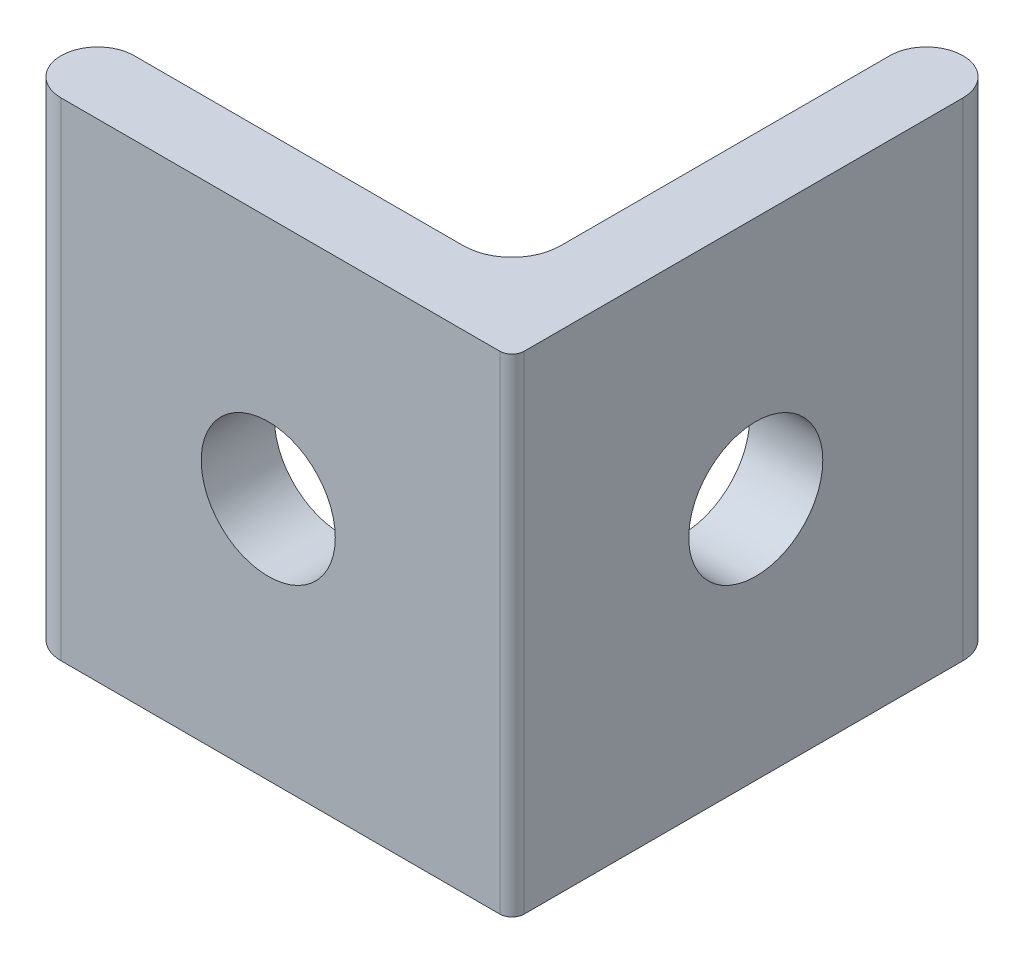
ISO-10303-21;
HEADER;
FILE_DESCRIPTION(('STEP AP214'),'2;1');
FILE_NAME('part.step','',(''),(''),'','','');
FILE_SCHEMA(('AUTOMOTIVE_DESIGN { 1 0 10303 214 1 1 1 1 }'));
ENDSEC;
DATA;
#1=APPLICATION_CONTEXT('core data for automotive mechanical design processes');
#2=APPLICATION_PROTOCOL_DEFINITION('international standard','automotive_design',2000,#1);
#3=PRODUCT_CONTEXT('',#1,'mechanical');
#4=PRODUCT('Part','Part','',(#3));
#5=PRODUCT_RELATED_PRODUCT_CATEGORY('part','',(#4));
#6=PRODUCT_DEFINITION_FORMATION('','',#4);
#7=PRODUCT_DEFINITION_CONTEXT('part definition',#1,'design');
#8=PRODUCT_DEFINITION('design','',#6,#7);
#9=PRODUCT_DEFINITION_SHAPE('','',#8);
#10=(LENGTH_UNIT() NAMED_UNIT(*) SI_UNIT(.MILLI.,.METRE.));
#11=(NAMED_UNIT(*) PLANE_ANGLE_UNIT() SI_UNIT($,.RADIAN.));
#12=(NAMED_UNIT(*) SI_UNIT($,.STERADIAN.) SOLID_ANGLE_UNIT());
#13=UNCERTAINTY_MEASURE_WITH_UNIT(LENGTH_MEASURE(1.E-05),#10,'distance_accuracy_value','');
#14=(GEOMETRIC_REPRESENTATION_CONTEXT(3) GLOBAL_UNCERTAINTY_ASSIGNED_CONTEXT((#13)) GLOBAL_UNIT_ASSIGNED_CONTEXT((#10,
#11,#12)) REPRESENTATION_CONTEXT('',''));
#15=CARTESIAN_POINT('',(0.,0.,0.));
#16=DIRECTION('',(0.,0.,1.));
#17=DIRECTION('',(1.,0.,0.));
#18=AXIS2_PLACEMENT_3D('',#15,#16,#17);
#19=CARTESIAN_POINT('',(-10.,0.,-10.));
#20=DIRECTION('',(0.,1.,0.));
#21=DIRECTION('',(1.,0.,0.));
#22=AXIS2_PLACEMENT_3D('',#19,#20,#21);
#23=PLANE('',#22);
#24=CARTESIAN_POINT('',(-18.5,0.,-1.5));
#25=DIRECTION('',(0.,1.,0.));
#26=DIRECTION('',(0.,0.,-1.));
#27=AXIS2_PLACEMENT_3D('',#24,#25,#26);
#28=CIRCLE('',#27,1.5);
#29=CARTESIAN_POINT('',(-18.5,0.,-3.));
#30=VERTEX_POINT('',#29);
#31=CARTESIAN_POINT('',(-18.5,0.,0.));
#32=VERTEX_POINT('',#31);
#33=EDGE_CURVE('E26',#30,#32,#28,.T.);
#34=ORIENTED_EDGE('',*,*,#33,.F.);
#35=DIRECTION('',(-1.,0.,0.));
#36=VECTOR('',#35,1.);
#37=CARTESIAN_POINT('',(-5.,0.,-3.));
#38=LINE('',#37,#36);
#39=CARTESIAN_POINT('',(-5.,0.,-3.));
#40=VERTEX_POINT('',#39);
#41=EDGE_CURVE('E202',#40,#30,#38,.T.);
#42=ORIENTED_EDGE('',*,*,#41,.F.);
#43=CARTESIAN_POINT('',(-5.,0.,-5.));
#44=DIRECTION('',(0.,-1.,0.));
#45=DIRECTION('',(0.,0.,-1.));
#46=AXIS2_PLACEMENT_3D('',#43,#44,#45);
#47=CIRCLE('',#46,2.);
#48=CARTESIAN_POINT('',(-3.,0.,-5.));
#49=VERTEX_POINT('',#48);
#50=EDGE_CURVE('E187',#49,#40,#47,.T.);
#51=ORIENTED_EDGE('',*,*,#50,.F.);
#52=DIRECTION('',(0.,0.,1.));
#53=VECTOR('',#52,1.);
#54=CARTESIAN_POINT('',(-3.,0.,-18.5));
#55=LINE('',#54,#53);
#56=CARTESIAN_POINT('',(-3.,0.,-18.5));
#57=VERTEX_POINT('',#56);
#58=EDGE_CURVE('E181',#57,#49,#55,.T.);
#59=ORIENTED_EDGE('',*,*,#58,.F.);
#60=CARTESIAN_POINT('',(-1.5,0.,-18.5));
#61=DIRECTION('',(0.,1.,0.));
#62=DIRECTION('',(1.,0.,0.));
#63=AXIS2_PLACEMENT_3D('',#60,#61,#62);
#64=CIRCLE('',#63,1.5);
#65=CARTESIAN_POINT('',(0.,0.,-18.5));
#66=VERTEX_POINT('',#65);
#67=EDGE_CURVE('E183',#66,#57,#64,.T.);
#68=ORIENTED_EDGE('',*,*,#67,.F.);
#69=DIRECTION('',(0.,0.,-1.));
#70=VECTOR('',#69,1.);
#71=CARTESIAN_POINT('',(0.,0.,-0.5));
#72=LINE('',#71,#70);
#73=CARTESIAN_POINT('',(0.,0.,-0.5));
#74=VERTEX_POINT('',#73);
#75=EDGE_CURVE('E68',#74,#66,#72,.T.);
#76=ORIENTED_EDGE('',*,*,#75,.F.);
#77=CARTESIAN_POINT('',(-0.5,0.,-0.5));
#78=DIRECTION('',(0.,1.,0.));
#79=DIRECTION('',(0.,0.,1.));
#80=AXIS2_PLACEMENT_3D('',#77,#78,#79);
#81=CIRCLE('',#80,0.5);
#82=CARTESIAN_POINT('',(-0.5,0.,0.));
#83=VERTEX_POINT('',#82);
#84=EDGE_CURVE('E167',#83,#74,#81,.T.);
#85=ORIENTED_EDGE('',*,*,#84,.F.);
#86=DIRECTION('',(1.,0.,0.));
#87=VECTOR('',#86,1.);
#88=CARTESIAN_POINT('',(-18.5,0.,0.));
#89=LINE('',#88,#87);
#90=EDGE_CURVE('E162',#32,#83,#89,.T.);
#91=ORIENTED_EDGE('',*,*,#90,.F.);
#92=EDGE_LOOP('',(#34,#42,#51,#59,#68,#76,#85,#91));
#93=FACE_BOUND('',#92,.T.);
#94=ADVANCED_FACE('F15',(#93),#23,.F.);
#95=CARTESIAN_POINT('',(-10.,20.,-10.));
#96=DIRECTION('',(0.,1.,0.));
#97=DIRECTION('',(1.,0.,0.));
#98=AXIS2_PLACEMENT_3D('',#95,#96,#97);
#99=PLANE('',#98);
#100=CARTESIAN_POINT('',(-18.5,20.,-1.5));
#101=DIRECTION('',(0.,1.,0.));
#102=DIRECTION('',(0.,0.,-1.));
#103=AXIS2_PLACEMENT_3D('',#100,#101,#102);
#104=CIRCLE('',#103,1.5);
#105=CARTESIAN_POINT('',(-18.5,20.,-3.));
#106=VERTEX_POINT('',#105);
#107=CARTESIAN_POINT('',(-18.5,20.,0.));
#108=VERTEX_POINT('',#107);
#109=EDGE_CURVE('E10',#106,#108,#104,.T.);
#110=ORIENTED_EDGE('',*,*,#109,.T.);
#111=DIRECTION('',(1.,0.,0.));
#112=VECTOR('',#111,1.);
#113=CARTESIAN_POINT('',(-18.5,20.,0.));
#114=LINE('',#113,#112);
#115=CARTESIAN_POINT('',(-0.5,20.,0.));
#116=VERTEX_POINT('',#115);
#117=EDGE_CURVE('E161',#108,#116,#114,.T.);
#118=ORIENTED_EDGE('',*,*,#117,.T.);
#119=CARTESIAN_POINT('',(-0.5,20.,-0.5));
#120=DIRECTION('',(0.,1.,0.));
#121=DIRECTION('',(0.,0.,1.));
#122=AXIS2_PLACEMENT_3D('',#119,#120,#121);
#123=CIRCLE('',#122,0.5);
#124=CARTESIAN_POINT('',(0.,20.,-0.5));
#125=VERTEX_POINT('',#124);
#126=EDGE_CURVE('E170',#116,#125,#123,.T.);
#127=ORIENTED_EDGE('',*,*,#126,.T.);
#128=DIRECTION('',(0.,0.,-1.));
#129=VECTOR('',#128,1.);
#130=CARTESIAN_POINT('',(0.,20.,-0.5));
#131=LINE('',#130,#129);
#132=CARTESIAN_POINT('',(0.,20.,-18.5));
#133=VERTEX_POINT('',#132);
#134=EDGE_CURVE('E207',#125,#133,#131,.T.);
#135=ORIENTED_EDGE('',*,*,#134,.T.);
#136=CARTESIAN_POINT('',(-1.5,20.,-18.5));
#137=DIRECTION('',(0.,1.,0.));
#138=DIRECTION('',(1.,0.,0.));
#139=AXIS2_PLACEMENT_3D('',#136,#137,#138);
#140=CIRCLE('',#139,1.5);
#141=CARTESIAN_POINT('',(-3.,20.,-18.5));
#142=VERTEX_POINT('',#141);
#143=EDGE_CURVE('E80',#133,#142,#140,.T.);
#144=ORIENTED_EDGE('',*,*,#143,.T.);
#145=DIRECTION('',(0.,0.,1.));
#146=VECTOR('',#145,1.);
#147=CARTESIAN_POINT('',(-3.,20.,-18.5));
#148=LINE('',#147,#146);
#149=CARTESIAN_POINT('',(-3.,20.,-5.));
#150=VERTEX_POINT('',#149);
#151=EDGE_CURVE('E19',#142,#150,#148,.T.);
#152=ORIENTED_EDGE('',*,*,#151,.T.);
#153=CARTESIAN_POINT('',(-5.,20.,-5.));
#154=DIRECTION('',(0.,-1.,0.));
#155=DIRECTION('',(0.,0.,-1.));
#156=AXIS2_PLACEMENT_3D('',#153,#154,#155);
#157=CIRCLE('',#156,2.);
#158=CARTESIAN_POINT('',(-5.,20.,-3.));
#159=VERTEX_POINT('',#158);
#160=EDGE_CURVE('E182',#150,#159,#157,.T.);
#161=ORIENTED_EDGE('',*,*,#160,.T.);
#162=DIRECTION('',(-1.,0.,0.));
#163=VECTOR('',#162,1.);
#164=CARTESIAN_POINT('',(-5.,20.,-3.));
#165=LINE('',#164,#163);
#166=EDGE_CURVE('E201',#159,#106,#165,.T.);
#167=ORIENTED_EDGE('',*,*,#166,.T.);
#168=EDGE_LOOP('',(#110,#118,#127,#135,#144,#152,#161,#167));
#169=FACE_BOUND('',#168,.T.);
#170=ADVANCED_FACE('F226',(#169),#99,.T.);
#171=CARTESIAN_POINT('',(-18.5,0.,-1.5));
#172=DIRECTION('',(0.,1.,0.));
#173=DIRECTION('',(0.,0.,-1.));
#174=AXIS2_PLACEMENT_3D('',#171,#172,#173);
#175=CYLINDRICAL_SURFACE('',#174,1.5);
#176=ORIENTED_EDGE('',*,*,#33,.T.);
#177=DIRECTION('',(0.,1.,0.));
#178=VECTOR('',#177,1.);
#179=CARTESIAN_POINT('',(-18.5,0.,0.));
#180=LINE('',#179,#178);
#181=EDGE_CURVE('E158',#32,#108,#180,.T.);
#182=ORIENTED_EDGE('',*,*,#181,.T.);
#183=ORIENTED_EDGE('',*,*,#109,.F.);
#184=DIRECTION('',(0.,1.,0.));
#185=VECTOR('',#184,1.);
#186=CARTESIAN_POINT('',(-18.5,0.,-3.));
#187=LINE('',#186,#185);
#188=EDGE_CURVE('E197',#30,#106,#187,.T.);
#189=ORIENTED_EDGE('',*,*,#188,.F.);
#190=EDGE_LOOP('',(#176,#182,#183,#189));
#191=FACE_BOUND('',#190,.T.);
#192=ADVANCED_FACE('F242',(#191),#175,.T.);
#193=CARTESIAN_POINT('',(-18.5,0.,0.));
#194=DIRECTION('',(0.,0.,1.));
#195=DIRECTION('',(1.,0.,0.));
#196=AXIS2_PLACEMENT_3D('',#193,#194,#195);
#197=PLANE('',#196);
#198=CARTESIAN_POINT('',(-10.,10.,0.));
#199=DIRECTION('',(0.,0.,-1.));
#200=DIRECTION('',(-1.,0.,0.));
#201=AXIS2_PLACEMENT_3D('',#198,#199,#200);
#202=CIRCLE('',#201,2.75);
#203=CARTESIAN_POINT('',(-7.25,10.,0.));
#204=VERTEX_POINT('',#203);
#205=EDGE_CURVE('E212',#204,#204,#202,.T.);
#206=ORIENTED_EDGE('',*,*,#205,.T.);
#207=EDGE_LOOP('',(#206));
#208=FACE_BOUND('',#207,.T.);
#209=ORIENTED_EDGE('',*,*,#90,.T.);
#210=DIRECTION('',(0.,1.,0.));
#211=VECTOR('',#210,1.);
#212=CARTESIAN_POINT('',(-0.5,0.,0.));
#213=LINE('',#212,#211);
#214=EDGE_CURVE('E166',#83,#116,#213,.T.);
#215=ORIENTED_EDGE('',*,*,#214,.T.);
#216=ORIENTED_EDGE('',*,*,#117,.F.);
#217=ORIENTED_EDGE('',*,*,#181,.F.);
#218=EDGE_LOOP('',(#209,#215,#216,#217));
#219=FACE_BOUND('',#218,.T.);
#220=ADVANCED_FACE('F17',(#208,#219),#197,.T.);
#221=CARTESIAN_POINT('',(-0.5,0.,-0.5));
#222=DIRECTION('',(0.,1.,0.));
#223=DIRECTION('',(0.,0.,1.));
#224=AXIS2_PLACEMENT_3D('',#221,#222,#223);
#225=CYLINDRICAL_SURFACE('',#224,0.5);
#226=ORIENTED_EDGE('',*,*,#84,.T.);
#227=DIRECTION('',(0.,1.,0.));
#228=VECTOR('',#227,1.);
#229=CARTESIAN_POINT('',(0.,0.,-0.5));
#230=LINE('',#229,#228);
#231=EDGE_CURVE('E171',#74,#125,#230,.T.);
#232=ORIENTED_EDGE('',*,*,#231,.T.);
#233=ORIENTED_EDGE('',*,*,#126,.F.);
#234=ORIENTED_EDGE('',*,*,#214,.F.);
#235=EDGE_LOOP('',(#226,#232,#233,#234));
#236=FACE_BOUND('',#235,.T.);
#237=ADVANCED_FACE('F254',(#236),#225,.T.);
#238=CARTESIAN_POINT('',(0.,0.,-0.5));
#239=DIRECTION('',(1.,0.,0.));
#240=DIRECTION('',(0.,0.,-1.));
#241=AXIS2_PLACEMENT_3D('',#238,#239,#240);
#242=PLANE('',#241);
#243=CARTESIAN_POINT('',(0.,10.,-10.));
#244=DIRECTION('',(-1.,0.,0.));
#245=DIRECTION('',(0.,0.,1.));
#246=AXIS2_PLACEMENT_3D('',#243,#244,#245);
#247=CIRCLE('',#246,2.75);
#248=CARTESIAN_POINT('',(0.,10.,-12.75));
#249=VERTEX_POINT('',#248);
#250=EDGE_CURVE('E136',#249,#249,#247,.T.);
#251=ORIENTED_EDGE('',*,*,#250,.T.);
#252=EDGE_LOOP('',(#251));
#253=FACE_BOUND('',#252,.T.);
#254=ORIENTED_EDGE('',*,*,#75,.T.);
#255=DIRECTION('',(0.,1.,0.));
#256=VECTOR('',#255,1.);
#257=CARTESIAN_POINT('',(0.,0.,-18.5));
#258=LINE('',#257,#256);
#259=EDGE_CURVE('E155',#66,#133,#258,.T.);
#260=ORIENTED_EDGE('',*,*,#259,.T.);
#261=ORIENTED_EDGE('',*,*,#134,.F.);
#262=ORIENTED_EDGE('',*,*,#231,.F.);
#263=EDGE_LOOP('',(#254,#260,#261,#262));
#264=FACE_BOUND('',#263,.T.);
#265=ADVANCED_FACE('F137',(#253,#264),#242,.T.);
#266=CARTESIAN_POINT('',(-1.5,0.,-18.5));
#267=DIRECTION('',(0.,1.,0.));
#268=DIRECTION('',(1.,0.,0.));
#269=AXIS2_PLACEMENT_3D('',#266,#267,#268);
#270=CYLINDRICAL_SURFACE('',#269,1.5);
#271=ORIENTED_EDGE('',*,*,#67,.T.);
#272=DIRECTION('',(0.,1.,0.));
#273=VECTOR('',#272,1.);
#274=CARTESIAN_POINT('',(-3.,0.,-18.5));
#275=LINE('',#274,#273);
#276=EDGE_CURVE('E186',#57,#142,#275,.T.);
#277=ORIENTED_EDGE('',*,*,#276,.T.);
#278=ORIENTED_EDGE('',*,*,#143,.F.);
#279=ORIENTED_EDGE('',*,*,#259,.F.);
#280=EDGE_LOOP('',(#271,#277,#278,#279));
#281=FACE_BOUND('',#280,.T.);
#282=ADVANCED_FACE('F260',(#281),#270,.T.);
#283=CARTESIAN_POINT('',(-3.,0.,-18.5));
#284=DIRECTION('',(-1.,0.,0.));
#285=DIRECTION('',(0.,1.,0.));
#286=AXIS2_PLACEMENT_3D('',#283,#284,#285);
#287=PLANE('',#286);
#288=CARTESIAN_POINT('',(-3.,10.,-10.));
#289=DIRECTION('',(1.,0.,0.));
#290=DIRECTION('',(0.,0.,1.));
#291=AXIS2_PLACEMENT_3D('',#288,#289,#290);
#292=CIRCLE('',#291,2.75);
#293=CARTESIAN_POINT('',(-3.,10.,-7.25));
#294=VERTEX_POINT('',#293);
#295=CARTESIAN_POINT('',(-3.,10.,-12.75));
#296=VERTEX_POINT('',#295);
#297=EDGE_CURVE('E193',#294,#296,#292,.T.);
#298=ORIENTED_EDGE('',*,*,#297,.T.);
#299=CARTESIAN_POINT('',(-3.,10.,-10.));
#300=DIRECTION('',(1.,0.,0.));
#301=DIRECTION('',(0.,0.,1.));
#302=AXIS2_PLACEMENT_3D('',#299,#300,#301);
#303=CIRCLE('',#302,2.75);
#304=EDGE_CURVE('E150',#296,#294,#303,.T.);
#305=ORIENTED_EDGE('',*,*,#304,.T.);
#306=EDGE_LOOP('',(#298,#305));
#307=FACE_BOUND('',#306,.T.);
#308=ORIENTED_EDGE('',*,*,#58,.T.);
#309=DIRECTION('',(0.,1.,0.));
#310=VECTOR('',#309,1.);
#311=CARTESIAN_POINT('',(-3.,0.,-5.));
#312=LINE('',#311,#310);
#313=EDGE_CURVE('E177',#49,#150,#312,.T.);
#314=ORIENTED_EDGE('',*,*,#313,.T.);
#315=ORIENTED_EDGE('',*,*,#151,.F.);
#316=ORIENTED_EDGE('',*,*,#276,.F.);
#317=EDGE_LOOP('',(#308,#314,#315,#316));
#318=FACE_BOUND('',#317,.T.);
#319=ADVANCED_FACE('F264',(#307,#318),#287,.T.);
#320=CARTESIAN_POINT('',(-5.,0.,-5.));
#321=DIRECTION('',(0.,1.,0.));
#322=DIRECTION('',(0.,0.,-1.));
#323=AXIS2_PLACEMENT_3D('',#320,#321,#322);
#324=CYLINDRICAL_SURFACE('',#323,2.);
#325=ORIENTED_EDGE('',*,*,#50,.T.);
#326=DIRECTION('',(0.,1.,0.));
#327=VECTOR('',#326,1.);
#328=CARTESIAN_POINT('',(-5.,0.,-3.));
#329=LINE('',#328,#327);
#330=EDGE_CURVE('E190',#40,#159,#329,.T.);
#331=ORIENTED_EDGE('',*,*,#330,.T.);
#332=ORIENTED_EDGE('',*,*,#160,.F.);
#333=ORIENTED_EDGE('',*,*,#313,.F.);
#334=EDGE_LOOP('',(#325,#331,#332,#333));
#335=FACE_BOUND('',#334,.T.);
#336=ADVANCED_FACE('F232',(#335),#324,.F.);
#337=CARTESIAN_POINT('',(-5.,0.,-3.));
#338=DIRECTION('',(0.,0.,-1.));
#339=DIRECTION('',(-1.,0.,0.));
#340=AXIS2_PLACEMENT_3D('',#337,#338,#339);
#341=PLANE('',#340);
#342=CARTESIAN_POINT('',(-10.,10.,-3.));
#343=DIRECTION('',(0.,0.,1.));
#344=DIRECTION('',(-1.,0.,0.));
#345=AXIS2_PLACEMENT_3D('',#342,#343,#344);
#346=CIRCLE('',#345,2.75);
#347=CARTESIAN_POINT('',(-12.75,10.,-3.));
#348=VERTEX_POINT('',#347);
#349=CARTESIAN_POINT('',(-7.25,10.,-3.));
#350=VERTEX_POINT('',#349);
#351=EDGE_CURVE('E141',#348,#350,#346,.T.);
#352=ORIENTED_EDGE('',*,*,#351,.T.);
#353=CARTESIAN_POINT('',(-10.,10.,-3.));
#354=DIRECTION('',(0.,0.,1.));
#355=DIRECTION('',(-1.,0.,0.));
#356=AXIS2_PLACEMENT_3D('',#353,#354,#355);
#357=CIRCLE('',#356,2.75);
#358=EDGE_CURVE('E129',#350,#348,#357,.T.);
#359=ORIENTED_EDGE('',*,*,#358,.T.);
#360=EDGE_LOOP('',(#352,#359));
#361=FACE_BOUND('',#360,.T.);
#362=ORIENTED_EDGE('',*,*,#41,.T.);
#363=ORIENTED_EDGE('',*,*,#188,.T.);
#364=ORIENTED_EDGE('',*,*,#166,.F.);
#365=ORIENTED_EDGE('',*,*,#330,.F.);
#366=EDGE_LOOP('',(#362,#363,#364,#365));
#367=FACE_BOUND('',#366,.T.);
#368=ADVANCED_FACE('F239',(#361,#367),#341,.T.);
#369=CARTESIAN_POINT('',(-10.,10.,8.1));
#370=DIRECTION('',(0.,0.,-1.));
#371=DIRECTION('',(-1.,0.,0.));
#372=AXIS2_PLACEMENT_3D('',#369,#370,#371);
#373=CYLINDRICAL_SURFACE('',#372,2.75);
#374=ORIENTED_EDGE('',*,*,#351,.F.);
#375=ORIENTED_EDGE('',*,*,#358,.F.);
#376=DIRECTION('',(0.,0.,1.));
#377=VECTOR('',#376,1.);
#378=CARTESIAN_POINT('',(-7.25,10.,8.1));
#379=LINE('',#378,#377);
#380=EDGE_CURVE('E208',#350,#204,#379,.T.);
#381=ORIENTED_EDGE('',*,*,#380,.T.);
#382=ORIENTED_EDGE('',*,*,#205,.F.);
#383=ORIENTED_EDGE('',*,*,#380,.F.);
#384=EDGE_LOOP('',(#374,#375,#381,#382,#383));
#385=FACE_BOUND('',#384,.T.);
#386=ADVANCED_FACE('F280',(#385),#373,.F.);
#387=CARTESIAN_POINT('',(8.1,10.,-10.));
#388=DIRECTION('',(-1.,0.,0.));
#389=DIRECTION('',(0.,0.,1.));
#390=AXIS2_PLACEMENT_3D('',#387,#388,#389);
#391=CYLINDRICAL_SURFACE('',#390,2.75);
#392=ORIENTED_EDGE('',*,*,#297,.F.);
#393=ORIENTED_EDGE('',*,*,#304,.F.);
#394=DIRECTION('',(1.,0.,0.));
#395=VECTOR('',#394,1.);
#396=CARTESIAN_POINT('',(8.1,10.,-12.75));
#397=LINE('',#396,#395);
#398=EDGE_CURVE('E142',#296,#249,#397,.T.);
#399=ORIENTED_EDGE('',*,*,#398,.T.);
#400=ORIENTED_EDGE('',*,*,#250,.F.);
#401=ORIENTED_EDGE('',*,*,#398,.F.);
#402=EDGE_LOOP('',(#392,#393,#399,#400,#401));
#403=FACE_BOUND('',#402,.T.);
#404=ADVANCED_FACE('F288',(#403),#391,.F.);
#405=CLOSED_SHELL('',(#94,#170,#192,#220,#237,#265,#282,#319,#336,#368,#386,#404));
#406=MANIFOLD_SOLID_BREP('B1',#405);
#407=ADVANCED_BREP_SHAPE_REPRESENTATION('',(#18,#406),#14);
#408=SHAPE_DEFINITION_REPRESENTATION(#9,#407);
ENDSEC;
END-ISO-10303-21;
